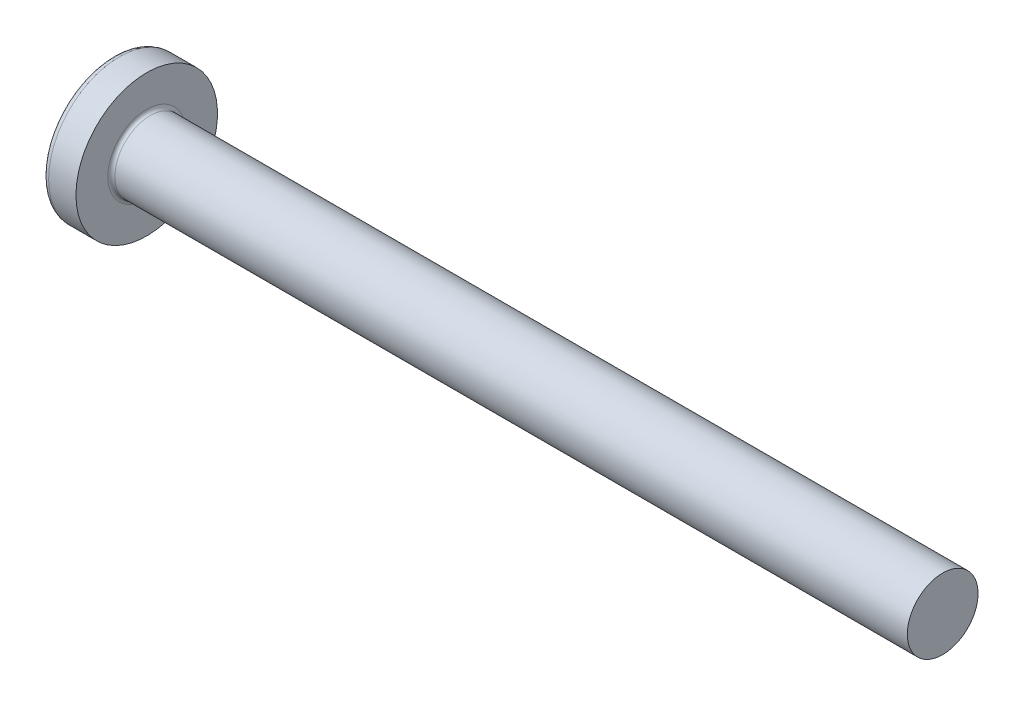
ISO-10303-21;
HEADER;
FILE_DESCRIPTION(('STEP AP214'),'2;1');
FILE_NAME('part.step','',(''),(''),'','','');
FILE_SCHEMA(('AUTOMOTIVE_DESIGN { 1 0 10303 214 1 1 1 1 }'));
ENDSEC;
DATA;
#1=APPLICATION_CONTEXT('core data for automotive mechanical design processes');
#2=APPLICATION_PROTOCOL_DEFINITION('international standard','automotive_design',2000,#1);
#3=PRODUCT_CONTEXT('',#1,'mechanical');
#4=PRODUCT('Part','Part','',(#3));
#5=PRODUCT_RELATED_PRODUCT_CATEGORY('part','',(#4));
#6=PRODUCT_DEFINITION_FORMATION('','',#4);
#7=PRODUCT_DEFINITION_CONTEXT('part definition',#1,'design');
#8=PRODUCT_DEFINITION('design','',#6,#7);
#9=PRODUCT_DEFINITION_SHAPE('','',#8);
#10=(LENGTH_UNIT() NAMED_UNIT(*) SI_UNIT(.MILLI.,.METRE.));
#11=(NAMED_UNIT(*) PLANE_ANGLE_UNIT() SI_UNIT($,.RADIAN.));
#12=(NAMED_UNIT(*) SI_UNIT($,.STERADIAN.) SOLID_ANGLE_UNIT());
#13=UNCERTAINTY_MEASURE_WITH_UNIT(LENGTH_MEASURE(1.E-05),#10,'distance_accuracy_value','');
#14=(GEOMETRIC_REPRESENTATION_CONTEXT(3) GLOBAL_UNCERTAINTY_ASSIGNED_CONTEXT((#13)) GLOBAL_UNIT_ASSIGNED_CONTEXT((#10,
#11,#12)) REPRESENTATION_CONTEXT('',''));
#15=CARTESIAN_POINT('',(0.,0.,0.));
#16=DIRECTION('',(0.,0.,1.));
#17=DIRECTION('',(1.,0.,0.));
#18=AXIS2_PLACEMENT_3D('',#15,#16,#17);
#19=CARTESIAN_POINT('',(6.5,0.,0.));
#20=DIRECTION('',(-1.,0.,0.));
#21=DIRECTION('',(0.,1.,0.));
#22=AXIS2_PLACEMENT_3D('',#19,#20,#21);
#23=SPHERICAL_SURFACE('',#22,6.5);
#24=CARTESIAN_POINT('',(1.26538895452803,0.,0.));
#25=DIRECTION('',(-1.,0.,0.));
#26=DIRECTION('',(0.,0.,1.));
#27=AXIS2_PLACEMENT_3D('',#24,#25,#26);
#28=CIRCLE('',#27,3.85342019543974);
#29=CARTESIAN_POINT('',(1.26538895452803,0.,3.85342019543974));
#30=VERTEX_POINT('',#29);
#31=EDGE_CURVE('E213',#30,#30,#28,.T.);
#32=ORIENTED_EDGE('',*,*,#31,.T.);
#33=EDGE_LOOP('',(#32));
#34=FACE_BOUND('',#33,.T.);
#35=CARTESIAN_POINT('',(0.0788099820016241,0.,0.));
#36=DIRECTION('',(1.,0.,0.));
#37=DIRECTION('',(0.,0.,-1.));
#38=AXIS2_PLACEMENT_3D('',#35,#36,#37);
#39=CIRCLE('',#38,1.0091178091571);
#40=CARTESIAN_POINT('',(0.0788099820016251,-0.514999999999997,-0.867809744562727));
#41=VERTEX_POINT('',#40);
#42=CARTESIAN_POINT('',(0.0788099820016241,-0.867809744562722,-0.515));
#43=VERTEX_POINT('',#42);
#44=EDGE_CURVE('E340',#41,#43,#39,.F.);
#45=ORIENTED_EDGE('',*,*,#44,.F.);
#46=CARTESIAN_POINT('',(6.5,-0.515,0.));
#47=DIRECTION('',(0.,1.,0.));
#48=DIRECTION('',(0.,0.,1.));
#49=AXIS2_PLACEMENT_3D('',#46,#47,#48);
#50=CIRCLE('',#49,6.47956595768575);
#51=CARTESIAN_POINT('',(0.331830520157854,-0.514999999999993,-1.98455543332603));
#52=VERTEX_POINT('',#51);
#53=EDGE_CURVE('E273',#52,#41,#50,.T.);
#54=ORIENTED_EDGE('',*,*,#53,.F.);
#55=CARTESIAN_POINT('',(6.06443225879603,0.,0.873613881878153));
#56=DIRECTION('',(0.446197753347436,0.,-0.894934391398443));
#57=DIRECTION('',(-0.894934391398442,0.,-0.446197753347436));
#58=AXIS2_PLACEMENT_3D('',#55,#56,#57);
#59=CIRCLE('',#58,6.42628038045433);
#60=CARTESIAN_POINT('',(0.331830520157854,0.515000000000007,-1.98455543332603));
#61=VERTEX_POINT('',#60);
#62=EDGE_CURVE('E247',#52,#61,#59,.T.);
#63=ORIENTED_EDGE('',*,*,#62,.T.);
#64=CARTESIAN_POINT('',(6.5,0.515,0.));
#65=DIRECTION('',(0.,-1.,0.));
#66=DIRECTION('',(0.,0.,-1.));
#67=AXIS2_PLACEMENT_3D('',#64,#65,#66);
#68=CIRCLE('',#67,6.47956595768575);
#69=CARTESIAN_POINT('',(0.0788099820016249,0.515000000000003,-0.867809744562724));
#70=VERTEX_POINT('',#69);
#71=EDGE_CURVE('E302',#70,#61,#68,.T.);
#72=ORIENTED_EDGE('',*,*,#71,.F.);
#73=CARTESIAN_POINT('',(0.0788099820016241,0.867809744562721,-0.515));
#74=VERTEX_POINT('',#73);
#75=EDGE_CURVE('E355',#74,#70,#39,.F.);
#76=ORIENTED_EDGE('',*,*,#75,.F.);
#77=CARTESIAN_POINT('',(6.5,0.,-0.515));
#78=DIRECTION('',(0.,0.,1.));
#79=DIRECTION('',(1.,0.,0.));
#80=AXIS2_PLACEMENT_3D('',#77,#78,#79);
#81=CIRCLE('',#80,6.47956595768575);
#82=CARTESIAN_POINT('',(0.331830520157856,1.98455543332603,-0.515));
#83=VERTEX_POINT('',#82);
#84=EDGE_CURVE('E241',#83,#74,#81,.T.);
#85=ORIENTED_EDGE('',*,*,#84,.F.);
#86=CARTESIAN_POINT('',(6.06443225879604,-0.873613881878154,0.));
#87=DIRECTION('',(0.446197753347436,0.894934391398443,0.));
#88=DIRECTION('',(-0.894934391398442,0.446197753347436,0.));
#89=AXIS2_PLACEMENT_3D('',#86,#87,#88);
#90=CIRCLE('',#89,6.42628038045433);
#91=CARTESIAN_POINT('',(0.331830520157856,1.98455543332603,0.515));
#92=VERTEX_POINT('',#91);
#93=EDGE_CURVE('E244',#83,#92,#90,.T.);
#94=ORIENTED_EDGE('',*,*,#93,.T.);
#95=CARTESIAN_POINT('',(6.5,0.,0.515));
#96=DIRECTION('',(0.,0.,-1.));
#97=DIRECTION('',(0.,1.,0.));
#98=AXIS2_PLACEMENT_3D('',#95,#96,#97);
#99=CIRCLE('',#98,6.47956595768575);
#100=CARTESIAN_POINT('',(0.0788099820016241,0.867809744562721,0.515));
#101=VERTEX_POINT('',#100);
#102=EDGE_CURVE('E237',#101,#92,#99,.T.);
#103=ORIENTED_EDGE('',*,*,#102,.F.);
#104=CARTESIAN_POINT('',(0.0788099820016251,0.514999999999997,0.867809744562727));
#105=VERTEX_POINT('',#104);
#106=EDGE_CURVE('E354',#105,#101,#39,.F.);
#107=ORIENTED_EDGE('',*,*,#106,.F.);
#108=CARTESIAN_POINT('',(0.331830520157856,0.514999999999993,1.98455543332603));
#109=VERTEX_POINT('',#108);
#110=EDGE_CURVE('E257',#109,#105,#68,.T.);
#111=ORIENTED_EDGE('',*,*,#110,.F.);
#112=CARTESIAN_POINT('',(6.06443225879603,0.,-0.873613881878153));
#113=DIRECTION('',(0.446197753347436,0.,0.894934391398443));
#114=DIRECTION('',(0.894934391398442,0.,-0.446197753347436));
#115=AXIS2_PLACEMENT_3D('',#112,#113,#114);
#116=CIRCLE('',#115,6.42628038045433);
#117=CARTESIAN_POINT('',(0.331830520157856,-0.515000000000007,1.98455543332603));
#118=VERTEX_POINT('',#117);
#119=EDGE_CURVE('E48',#109,#118,#116,.T.);
#120=ORIENTED_EDGE('',*,*,#119,.T.);
#121=CARTESIAN_POINT('',(0.0788099820016253,-0.515000000000003,0.867809744562724));
#122=VERTEX_POINT('',#121);
#123=EDGE_CURVE('E254',#122,#118,#50,.T.);
#124=ORIENTED_EDGE('',*,*,#123,.F.);
#125=CARTESIAN_POINT('',(0.0788099820016241,-0.867809744562722,0.515));
#126=VERTEX_POINT('',#125);
#127=EDGE_CURVE('E390',#126,#122,#39,.F.);
#128=ORIENTED_EDGE('',*,*,#127,.F.);
#129=CARTESIAN_POINT('',(0.331830520157854,-1.98455543332603,0.515));
#130=VERTEX_POINT('',#129);
#131=EDGE_CURVE('E238',#130,#126,#99,.T.);
#132=ORIENTED_EDGE('',*,*,#131,.F.);
#133=CARTESIAN_POINT('',(6.06443225879603,0.873613881878153,0.));
#134=DIRECTION('',(0.446197753347436,-0.894934391398443,0.));
#135=DIRECTION('',(0.894934391398442,0.446197753347436,0.));
#136=AXIS2_PLACEMENT_3D('',#133,#134,#135);
#137=CIRCLE('',#136,6.42628038045433);
#138=CARTESIAN_POINT('',(0.331830520157854,-1.98455543332603,-0.515));
#139=VERTEX_POINT('',#138);
#140=EDGE_CURVE('E234',#130,#139,#137,.T.);
#141=ORIENTED_EDGE('',*,*,#140,.T.);
#142=EDGE_CURVE('E63',#43,#139,#81,.T.);
#143=ORIENTED_EDGE('',*,*,#142,.F.);
#144=EDGE_LOOP('',(#45,#54,#63,#72,#76,#85,#94,#103,#107,#111,#120,#124,#128,#132,#141,#143));
#145=FACE_BOUND('',#144,.T.);
#146=ADVANCED_FACE('F34',(#34,#145),#23,.T.);
#147=CARTESIAN_POINT('',(0.,2.15,-0.515));
#148=DIRECTION('',(0.,0.,1.));
#149=DIRECTION('',(1.,0.,0.));
#150=AXIS2_PLACEMENT_3D('',#147,#148,#149);
#151=PLANE('',#150);
#152=ORIENTED_EDGE('',*,*,#84,.T.);
#153=CARTESIAN_POINT('',(-1.51195208675156,0.994972220320187,-0.515));
#154=CARTESIAN_POINT('',(-1.20405981949279,0.970722016949957,-0.515));
#155=CARTESIAN_POINT('',(-0.896180907521174,0.94629910991965,-0.515));
#156=CARTESIAN_POINT('',(-0.280449079832185,0.896981122427851,-0.515));
#157=CARTESIAN_POINT('',(0.0274038344396872,0.872086023934882,-0.515));
#158=CARTESIAN_POINT('',(0.489146739515351,0.83429553519528,-0.515));
#159=CARTESIAN_POINT('',(0.643055047553846,0.821624058404092,-0.515));
#160=CARTESIAN_POINT('',(0.950856520197141,0.796108332639504,-0.515));
#161=CARTESIAN_POINT('',(1.10474968487868,0.783264084592465,-0.515));
#162=CARTESIAN_POINT('',(1.41251352095103,0.757376569093378,-0.515));
#163=CARTESIAN_POINT('',(1.56638419296577,0.744333309065218,-0.515));
#164=CARTESIAN_POINT('',(1.87410847343335,0.718013273188896,-0.515));
#165=CARTESIAN_POINT('',(2.02796208151372,0.704736492982792,-0.515));
#166=CARTESIAN_POINT('',(2.36455311890989,0.675386943006726,-0.515));
#167=CARTESIAN_POINT('',(2.54728562293342,0.659257575640986,-0.515));
#168=CARTESIAN_POINT('',(2.91270624109256,0.626517182479888,-0.515));
#169=CARTESIAN_POINT('',(3.09539435554037,0.609906160177238,-0.515));
#170=CARTESIAN_POINT('',(3.46069832191612,0.576073027116422,-0.515));
#171=CARTESIAN_POINT('',(3.64331417870068,0.558850968932728,-0.515));
#172=CARTESIAN_POINT('',(4.00847437496567,0.523604864540038,-0.515));
#173=CARTESIAN_POINT('',(4.19101871216888,0.505580794604253,-0.515));
#174=CARTESIAN_POINT('',(4.55606208157937,0.468429191666488,-0.515));
#175=CARTESIAN_POINT('',(4.73856107358022,0.449301262281854,-0.515));
#176=CARTESIAN_POINT('',(5.10337547353418,0.409473604748925,-0.515));
#177=CARTESIAN_POINT('',(5.28569089526422,0.38877400510607,-0.515));
#178=CARTESIAN_POINT('',(5.55897278495412,0.355828287527265,-0.515));
#179=CARTESIAN_POINT('',(5.65005277419686,0.344527918782739,-0.515));
#180=CARTESIAN_POINT('',(5.83209904103607,0.321075174263032,-0.515));
#181=CARTESIAN_POINT('',(5.92306532397915,0.308922840209687,-0.515));
#182=CARTESIAN_POINT('',(6.10486078872898,0.283427334451931,-0.515));
#183=CARTESIAN_POINT('',(6.19568992299379,0.270083817601715,-0.515));
#184=CARTESIAN_POINT('',(6.33172773785679,0.248701420809952,-0.515));
#185=CARTESIAN_POINT('',(6.37704304473344,0.241345446705305,-0.515));
#186=CARTESIAN_POINT('',(6.4675722520141,0.226018953559339,-0.515));
#187=CARTESIAN_POINT('',(6.51278614568083,0.218048394864477,-0.515));
#188=CARTESIAN_POINT('',(6.55793125759548,0.209691465274946,-0.515));
#189=B_SPLINE_CURVE_WITH_KNOTS('',3,(#153,#154,#155,#156,#157,#158,#159,#160,#161,#162,#163,
#164,#165,#166,#167,#168,#169,#170,#171,#172,#173,#174,#175,#176,#177,#178,#179,#180,#181,#182,
#183,#184,#185,#186,#187,#188),.UNSPECIFIED.,.F.,.F.,(4,2,2,2,2,2,2,2,2,2,2,2,2,2,2,2,2,4),(0.,
0.92653770978172,1.85311087258339,2.31639796016285,2.77968256468771,3.24294992902054,
3.70622594801777,4.25655436065378,4.80687878359543,5.35715597005738,5.90744944680717,
6.45794177197673,7.00838913527399,7.28372117336898,7.55903973750591,7.83443833587748,
7.97216007460854,8.10989070671571),.UNSPECIFIED.);
#190=CARTESIAN_POINT('',(2.34,0.677477674908923,-0.515));
#191=VERTEX_POINT('',#190);
#192=EDGE_CURVE('E377',#74,#191,#189,.T.);
#193=ORIENTED_EDGE('',*,*,#192,.T.);
#194=DIRECTION('',(0.,1.,0.));
#195=VECTOR('',#194,1.);
#196=CARTESIAN_POINT('',(2.34,-0.983319232260742,-0.515));
#197=LINE('',#196,#195);
#198=CARTESIAN_POINT('',(2.34,0.983319232260743,-0.515));
#199=VERTEX_POINT('',#198);
#200=EDGE_CURVE('E323',#191,#199,#197,.T.);
#201=ORIENTED_EDGE('',*,*,#200,.T.);
#202=DIRECTION('',(0.894934391398442,-0.446197753347436,0.));
#203=VECTOR('',#202,1.);
#204=CARTESIAN_POINT('',(0.,2.15,-0.515));
#205=LINE('',#204,#203);
#206=EDGE_CURVE('E214',#83,#199,#205,.T.);
#207=ORIENTED_EDGE('',*,*,#206,.F.);
#208=EDGE_LOOP('',(#152,#193,#201,#207));
#209=FACE_BOUND('',#208,.T.);
#210=ADVANCED_FACE('F169',(#209),#151,.T.);
#211=CARTESIAN_POINT('',(2.34,-0.983319232260742,-0.515));
#212=VERTEX_POINT('',#211);
#213=CARTESIAN_POINT('',(2.34,-0.677477674908923,-0.515));
#214=VERTEX_POINT('',#213);
#215=EDGE_CURVE('E222',#212,#214,#197,.T.);
#216=ORIENTED_EDGE('',*,*,#215,.T.);
#217=CARTESIAN_POINT('',(-1.51195208675156,-0.994972220320187,-0.515));
#218=CARTESIAN_POINT('',(-1.20405981949279,-0.970722016949957,-0.515));
#219=CARTESIAN_POINT('',(-0.896180907521174,-0.94629910991965,-0.515));
#220=CARTESIAN_POINT('',(-0.280449079832185,-0.896981122427851,-0.515));
#221=CARTESIAN_POINT('',(0.0274038344396872,-0.872086023934882,-0.515));
#222=CARTESIAN_POINT('',(0.489146739515351,-0.83429553519528,-0.515));
#223=CARTESIAN_POINT('',(0.643055047553846,-0.821624058404092,-0.515));
#224=CARTESIAN_POINT('',(0.950856520197141,-0.796108332639504,-0.515));
#225=CARTESIAN_POINT('',(1.10474968487868,-0.783264084592465,-0.515));
#226=CARTESIAN_POINT('',(1.41251352095103,-0.757376569093378,-0.515));
#227=CARTESIAN_POINT('',(1.56638419296577,-0.744333309065218,-0.515));
#228=CARTESIAN_POINT('',(1.87410847343335,-0.718013273188896,-0.515));
#229=CARTESIAN_POINT('',(2.02796208151372,-0.704736492982792,-0.515));
#230=CARTESIAN_POINT('',(2.36455311890989,-0.675386943006726,-0.515));
#231=CARTESIAN_POINT('',(2.54728562293342,-0.659257575640986,-0.515));
#232=CARTESIAN_POINT('',(2.91270624109256,-0.626517182479888,-0.515));
#233=CARTESIAN_POINT('',(3.09539435554038,-0.609906160177238,-0.515));
#234=CARTESIAN_POINT('',(3.46069832191613,-0.576073027116421,-0.515));
#235=CARTESIAN_POINT('',(3.64331417870068,-0.558850968932727,-0.515));
#236=CARTESIAN_POINT('',(4.00847437496567,-0.523604864540037,-0.515));
#237=CARTESIAN_POINT('',(4.19101871216888,-0.505580794604253,-0.515));
#238=CARTESIAN_POINT('',(4.55606208157937,-0.468429191666488,-0.515));
#239=CARTESIAN_POINT('',(4.73856107358023,-0.449301262281854,-0.515));
#240=CARTESIAN_POINT('',(5.10337547353419,-0.409473604748925,-0.515));
#241=CARTESIAN_POINT('',(5.28569089526422,-0.38877400510607,-0.515));
#242=CARTESIAN_POINT('',(5.55897278495412,-0.355828287527264,-0.515));
#243=CARTESIAN_POINT('',(5.65005277419686,-0.344527918782738,-0.515));
#244=CARTESIAN_POINT('',(5.83209904103608,-0.321075174263031,-0.515));
#245=CARTESIAN_POINT('',(5.92306532397915,-0.308922840209686,-0.515));
#246=CARTESIAN_POINT('',(6.10486078872898,-0.283427334451931,-0.515));
#247=CARTESIAN_POINT('',(6.1956899229938,-0.270083817601715,-0.515));
#248=CARTESIAN_POINT('',(6.33172773785679,-0.248701420809952,-0.515));
#249=CARTESIAN_POINT('',(6.37704304473344,-0.241345446705305,-0.515));
#250=CARTESIAN_POINT('',(6.4675722520141,-0.226018953559339,-0.515));
#251=CARTESIAN_POINT('',(6.51278614568083,-0.218048394864477,-0.515));
#252=CARTESIAN_POINT('',(6.55793125759549,-0.209691465274945,-0.515));
#253=B_SPLINE_CURVE_WITH_KNOTS('',3,(#217,#218,#219,#220,#221,#222,#223,#224,#225,#226,#227,
#228,#229,#230,#231,#232,#233,#234,#235,#236,#237,#238,#239,#240,#241,#242,#243,#244,#245,#246,
#247,#248,#249,#250,#251,#252),.UNSPECIFIED.,.F.,.F.,(4,2,2,2,2,2,2,2,2,2,2,2,2,2,2,2,2,4),(0.,
0.92653770978172,1.85311087258339,2.31639796016285,2.77968256468771,3.24294992902054,
3.70622594801777,4.25655436065378,4.80687878359543,5.35715597005738,5.90744944680718,
6.45794177197673,7.008389135274,7.28372117336899,7.55903973750591,7.83443833587748,
7.97216007460854,8.10989070671571),.UNSPECIFIED.);
#254=EDGE_CURVE('E353',#214,#43,#253,.F.);
#255=ORIENTED_EDGE('',*,*,#254,.T.);
#256=ORIENTED_EDGE('',*,*,#142,.T.);
#257=DIRECTION('',(0.894934391398442,0.446197753347436,0.));
#258=VECTOR('',#257,1.);
#259=CARTESIAN_POINT('',(0.,-2.15,-0.515));
#260=LINE('',#259,#258);
#261=EDGE_CURVE('E305',#139,#212,#260,.T.);
#262=ORIENTED_EDGE('',*,*,#261,.T.);
#263=EDGE_LOOP('',(#216,#255,#256,#262));
#264=FACE_BOUND('',#263,.T.);
#265=ADVANCED_FACE('F175',(#264),#151,.T.);
#266=CARTESIAN_POINT('',(0.,-2.15,0.515));
#267=DIRECTION('',(0.,0.,-1.));
#268=DIRECTION('',(0.,1.,0.));
#269=AXIS2_PLACEMENT_3D('',#266,#267,#268);
#270=PLANE('',#269);
#271=DIRECTION('',(0.,-1.,0.));
#272=VECTOR('',#271,1.);
#273=CARTESIAN_POINT('',(2.34,0.983319232260742,0.515));
#274=LINE('',#273,#272);
#275=CARTESIAN_POINT('',(2.34,0.983319232260743,0.515));
#276=VERTEX_POINT('',#275);
#277=CARTESIAN_POINT('',(2.34,0.677477674908923,0.515));
#278=VERTEX_POINT('',#277);
#279=EDGE_CURVE('E313',#276,#278,#274,.T.);
#280=ORIENTED_EDGE('',*,*,#279,.T.);
#281=CARTESIAN_POINT('',(-1.51195208754037,0.994972220382297,0.515));
#282=CARTESIAN_POINT('',(-1.20405982018868,0.970722017005064,0.515));
#283=CARTESIAN_POINT('',(-0.896180908124144,0.946299109967688,0.515));
#284=CARTESIAN_POINT('',(-0.280449080249312,0.896981122461527,0.515));
#285=CARTESIAN_POINT('',(0.0274038341154851,0.872086023961265,0.515));
#286=CARTESIAN_POINT('',(0.489146739371409,0.834295535207136,0.515));
#287=CARTESIAN_POINT('',(0.643055047497245,0.821624058408796,0.515));
#288=CARTESIAN_POINT('',(0.950856520315204,0.796108332629705,0.515));
#289=CARTESIAN_POINT('',(1.10474968508407,0.783264084575317,0.515));
#290=CARTESIAN_POINT('',(1.41251352133103,0.757376569061287,0.515));
#291=CARTESIAN_POINT('',(1.56638419343305,0.744333309025534,0.515));
#292=CARTESIAN_POINT('',(1.87410847407519,0.718013273133716,0.515));
#293=CARTESIAN_POINT('',(2.02796208224283,0.70473649291971,0.515));
#294=CARTESIAN_POINT('',(2.36455311972626,0.675386942934956,0.515));
#295=CARTESIAN_POINT('',(2.5472856237498,0.659257575568568,0.515));
#296=CARTESIAN_POINT('',(2.91270624190895,0.626517182406014,0.515));
#297=CARTESIAN_POINT('',(3.09539435635676,0.609906160102555,0.515));
#298=CARTESIAN_POINT('',(3.46069832273244,0.57607302703989,0.515));
#299=CARTESIAN_POINT('',(3.64331417951694,0.558850968855157,0.515));
#300=CARTESIAN_POINT('',(4.00847437578178,0.523604864460044,0.515));
#301=CARTESIAN_POINT('',(4.1910187129849,0.505580794522876,0.515));
#302=CARTESIAN_POINT('',(4.55606208239526,0.46842919158178,0.515));
#303=CARTESIAN_POINT('',(4.73856107439606,0.449301262195198,0.515));
#304=CARTESIAN_POINT('',(5.10337547434977,0.409473604657436,0.515));
#305=CARTESIAN_POINT('',(5.2856908960796,0.388774005011695,0.515));
#306=CARTESIAN_POINT('',(5.55897278576906,0.355828287427083,0.515));
#307=CARTESIAN_POINT('',(5.65005277501166,0.344527918680369,0.515));
#308=CARTESIAN_POINT('',(5.83209904185046,0.321075174155501,0.515));
#309=CARTESIAN_POINT('',(5.92306532479326,0.308922840099182,0.515));
#310=CARTESIAN_POINT('',(6.10486078954238,0.283427334334154,0.515));
#311=CARTESIAN_POINT('',(6.19568992380676,0.270083817479638,0.515));
#312=CARTESIAN_POINT('',(6.33172773866873,0.24870142067948,0.515));
#313=CARTESIAN_POINT('',(6.37704304554499,0.241345446571708,0.515));
#314=CARTESIAN_POINT('',(6.46757225282465,0.226018953418425,0.515));
#315=CARTESIAN_POINT('',(6.51278614649077,0.21804839471937,0.515));
#316=CARTESIAN_POINT('',(6.55793125840465,0.209691465124903,0.515));
#317=B_SPLINE_CURVE_WITH_KNOTS('',3,(#281,#282,#283,#284,#285,#286,#287,#288,#289,#290,#291,
#292,#293,#294,#295,#296,#297,#298,#299,#300,#301,#302,#303,#304,#305,#306,#307,#308,#309,#310,
#311,#312,#313,#314,#315,#316),.UNSPECIFIED.,.F.,.F.,(4,2,2,2,2,2,2,2,2,2,2,2,2,2,2,2,2,4),(0.,
0.926537710061277,1.85311087314258,2.31639796098494,2.77968256577269,3.24294993036838,
3.70622594962848,4.25655436226469,4.80687878520654,5.3571559716686,5.90744944841854,
6.45794177358856,7.00838913688618,7.28372117498156,7.55903973911884,7.83443833749096,
7.97216007622235,8.10989070832989),.UNSPECIFIED.);
#318=EDGE_CURVE('E278',#278,#101,#317,.F.);
#319=ORIENTED_EDGE('',*,*,#318,.T.);
#320=ORIENTED_EDGE('',*,*,#102,.T.);
#321=DIRECTION('',(0.894934391398442,-0.446197753347436,0.));
#322=VECTOR('',#321,1.);
#323=CARTESIAN_POINT('',(0.,2.15,0.515));
#324=LINE('',#323,#322);
#325=EDGE_CURVE('E219',#92,#276,#324,.T.);
#326=ORIENTED_EDGE('',*,*,#325,.T.);
#327=EDGE_LOOP('',(#280,#319,#320,#326));
#328=FACE_BOUND('',#327,.T.);
#329=ADVANCED_FACE('F373',(#328),#270,.T.);
#330=ORIENTED_EDGE('',*,*,#131,.T.);
#331=CARTESIAN_POINT('',(-1.51195208754037,-0.994972220382297,0.515));
#332=CARTESIAN_POINT('',(-1.20405982018868,-0.970722017005064,0.515));
#333=CARTESIAN_POINT('',(-0.896180908124144,-0.946299109967688,0.515));
#334=CARTESIAN_POINT('',(-0.280449080249312,-0.896981122461527,0.515));
#335=CARTESIAN_POINT('',(0.0274038341154852,-0.872086023961264,0.515));
#336=CARTESIAN_POINT('',(0.489146739371408,-0.834295535207136,0.515));
#337=CARTESIAN_POINT('',(0.643055047497245,-0.821624058408796,0.515));
#338=CARTESIAN_POINT('',(0.950856520315204,-0.796108332629705,0.515));
#339=CARTESIAN_POINT('',(1.10474968508407,-0.783264084575317,0.515));
#340=CARTESIAN_POINT('',(1.41251352133103,-0.757376569061287,0.515));
#341=CARTESIAN_POINT('',(1.56638419343305,-0.744333309025534,0.515));
#342=CARTESIAN_POINT('',(1.87410847407519,-0.718013273133716,0.515));
#343=CARTESIAN_POINT('',(2.02796208224283,-0.70473649291971,0.515));
#344=CARTESIAN_POINT('',(2.36455311972626,-0.675386942934956,0.515));
#345=CARTESIAN_POINT('',(2.5472856237498,-0.659257575568568,0.515));
#346=CARTESIAN_POINT('',(2.91270624190895,-0.626517182406014,0.515));
#347=CARTESIAN_POINT('',(3.09539435635676,-0.609906160102555,0.515));
#348=CARTESIAN_POINT('',(3.46069832273244,-0.57607302703989,0.515));
#349=CARTESIAN_POINT('',(3.64331417951694,-0.558850968855157,0.515));
#350=CARTESIAN_POINT('',(4.00847437578178,-0.523604864460045,0.515));
#351=CARTESIAN_POINT('',(4.1910187129849,-0.505580794522877,0.515));
#352=CARTESIAN_POINT('',(4.55606208239525,-0.46842919158178,0.515));
#353=CARTESIAN_POINT('',(4.73856107439606,-0.449301262195199,0.515));
#354=CARTESIAN_POINT('',(5.10337547434977,-0.409473604657436,0.515));
#355=CARTESIAN_POINT('',(5.2856908960796,-0.388774005011696,0.515));
#356=CARTESIAN_POINT('',(5.55897278576906,-0.355828287427083,0.515));
#357=CARTESIAN_POINT('',(5.65005277501166,-0.34452791868037,0.515));
#358=CARTESIAN_POINT('',(5.83209904185046,-0.321075174155501,0.515));
#359=CARTESIAN_POINT('',(5.92306532479326,-0.308922840099182,0.515));
#360=CARTESIAN_POINT('',(6.10486078954238,-0.283427334334154,0.515));
#361=CARTESIAN_POINT('',(6.19568992380675,-0.270083817479639,0.515));
#362=CARTESIAN_POINT('',(6.33172773866873,-0.24870142067948,0.515));
#363=CARTESIAN_POINT('',(6.37704304554499,-0.241345446571709,0.515));
#364=CARTESIAN_POINT('',(6.46757225282465,-0.226018953418425,0.515));
#365=CARTESIAN_POINT('',(6.51278614649077,-0.21804839471937,0.515));
#366=CARTESIAN_POINT('',(6.55793125840465,-0.209691465124903,0.515));
#367=B_SPLINE_CURVE_WITH_KNOTS('',3,(#331,#332,#333,#334,#335,#336,#337,#338,#339,#340,#341,
#342,#343,#344,#345,#346,#347,#348,#349,#350,#351,#352,#353,#354,#355,#356,#357,#358,#359,#360,
#361,#362,#363,#364,#365,#366),.UNSPECIFIED.,.F.,.F.,(4,2,2,2,2,2,2,2,2,2,2,2,2,2,2,2,2,4),(0.,
0.926537710061277,1.85311087314258,2.31639796098494,2.77968256577269,3.24294993036838,
3.70622594962848,4.25655436226469,4.80687878520654,5.3571559716686,5.90744944841854,
6.45794177358856,7.00838913688618,7.28372117498156,7.55903973911884,7.83443833749095,
7.97216007622235,8.10989070832989),.UNSPECIFIED.);
#368=CARTESIAN_POINT('',(2.34,-0.677477674908923,0.515));
#369=VERTEX_POINT('',#368);
#370=EDGE_CURVE('E391',#126,#369,#367,.T.);
#371=ORIENTED_EDGE('',*,*,#370,.T.);
#372=CARTESIAN_POINT('',(2.34,-0.983319232260742,0.515));
#373=VERTEX_POINT('',#372);
#374=EDGE_CURVE('E315',#369,#373,#274,.T.);
#375=ORIENTED_EDGE('',*,*,#374,.T.);
#376=DIRECTION('',(0.894934391398442,0.446197753347436,0.));
#377=VECTOR('',#376,1.);
#378=CARTESIAN_POINT('',(0.,-2.15,0.515));
#379=LINE('',#378,#377);
#380=EDGE_CURVE('E307',#130,#373,#379,.T.);
#381=ORIENTED_EDGE('',*,*,#380,.F.);
#382=EDGE_LOOP('',(#330,#371,#375,#381));
#383=FACE_BOUND('',#382,.T.);
#384=ADVANCED_FACE('F421',(#383),#270,.T.);
#385=CARTESIAN_POINT('',(2.34,0.983319232260742,-0.515));
#386=DIRECTION('',(-1.,0.,0.));
#387=DIRECTION('',(0.,0.,1.));
#388=AXIS2_PLACEMENT_3D('',#385,#386,#387);
#389=PLANE('',#388);
#390=ORIENTED_EDGE('',*,*,#374,.F.);
#391=CARTESIAN_POINT('',(2.34,0.,0.));
#392=DIRECTION('',(-1.,0.,0.));
#393=DIRECTION('',(0.,0.,1.));
#394=AXIS2_PLACEMENT_3D('',#391,#392,#393);
#395=CIRCLE('',#394,0.851);
#396=EDGE_CURVE('E348',#214,#369,#395,.T.);
#397=ORIENTED_EDGE('',*,*,#396,.F.);
#398=ORIENTED_EDGE('',*,*,#215,.F.);
#399=DIRECTION('',(0.,0.,1.));
#400=VECTOR('',#399,1.);
#401=CARTESIAN_POINT('',(2.34,-0.983319232260742,-0.515));
#402=LINE('',#401,#400);
#403=EDGE_CURVE('E310',#212,#373,#402,.T.);
#404=ORIENTED_EDGE('',*,*,#403,.T.);
#405=EDGE_LOOP('',(#390,#397,#398,#404));
#406=FACE_BOUND('',#405,.T.);
#407=ADVANCED_FACE('F414',(#406),#389,.T.);
#408=DIRECTION('',(0.,0.,-1.));
#409=VECTOR('',#408,1.);
#410=CARTESIAN_POINT('',(2.34,-0.515000000000004,0.983319232260741));
#411=LINE('',#410,#409);
#412=CARTESIAN_POINT('',(2.34,-0.514999999999998,-0.677477674908925));
#413=VERTEX_POINT('',#412);
#414=CARTESIAN_POINT('',(2.34,-0.514999999999996,-0.983319232260744));
#415=VERTEX_POINT('',#414);
#416=EDGE_CURVE('E296',#413,#415,#411,.T.);
#417=ORIENTED_EDGE('',*,*,#416,.F.);
#418=CARTESIAN_POINT('',(2.34,0.515000000000002,-0.677477674908921));
#419=VERTEX_POINT('',#418);
#420=EDGE_CURVE('E55',#419,#413,#395,.T.);
#421=ORIENTED_EDGE('',*,*,#420,.F.);
#422=DIRECTION('',(0.,0.,1.));
#423=VECTOR('',#422,1.);
#424=CARTESIAN_POINT('',(2.34,0.515000000000004,-0.983319232260741));
#425=LINE('',#424,#423);
#426=CARTESIAN_POINT('',(2.34,0.515000000000004,-0.983319232260741));
#427=VERTEX_POINT('',#426);
#428=EDGE_CURVE('E299',#427,#419,#425,.T.);
#429=ORIENTED_EDGE('',*,*,#428,.F.);
#430=DIRECTION('',(0.,-1.,0.));
#431=VECTOR('',#430,1.);
#432=CARTESIAN_POINT('',(2.34,0.515000000000004,-0.983319232260741));
#433=LINE('',#432,#431);
#434=EDGE_CURVE('E290',#427,#415,#433,.T.);
#435=ORIENTED_EDGE('',*,*,#434,.T.);
#436=EDGE_LOOP('',(#417,#421,#429,#435));
#437=FACE_BOUND('',#436,.T.);
#438=ADVANCED_FACE('F343',(#437),#389,.T.);
#439=ORIENTED_EDGE('',*,*,#200,.F.);
#440=EDGE_CURVE('E347',#278,#191,#395,.T.);
#441=ORIENTED_EDGE('',*,*,#440,.F.);
#442=ORIENTED_EDGE('',*,*,#279,.F.);
#443=DIRECTION('',(0.,0.,-1.));
#444=VECTOR('',#443,1.);
#445=CARTESIAN_POINT('',(2.34,0.983319232260742,0.515));
#446=LINE('',#445,#444);
#447=EDGE_CURVE('E316',#276,#199,#446,.T.);
#448=ORIENTED_EDGE('',*,*,#447,.T.);
#449=EDGE_LOOP('',(#439,#441,#442,#448));
#450=FACE_BOUND('',#449,.T.);
#451=ADVANCED_FACE('F415',(#450),#389,.T.);
#452=CARTESIAN_POINT('',(0.,0.514999999999993,2.15));
#453=DIRECTION('',(0.,-1.,0.));
#454=DIRECTION('',(1.,0.,0.));
#455=AXIS2_PLACEMENT_3D('',#452,#453,#454);
#456=PLANE('',#455);
#457=ORIENTED_EDGE('',*,*,#110,.T.);
#458=CARTESIAN_POINT('',(-1.51195208754037,0.514999999999997,0.994972220382299));
#459=CARTESIAN_POINT('',(-1.20405982018868,0.514999999999997,0.970722017005065));
#460=CARTESIAN_POINT('',(-0.896180908124144,0.514999999999997,0.94629910996769));
#461=CARTESIAN_POINT('',(-0.280449080249312,0.514999999999997,0.896981122461529));
#462=CARTESIAN_POINT('',(0.0274038341154852,0.514999999999997,0.872086023961266));
#463=CARTESIAN_POINT('',(0.489146739371409,0.514999999999997,0.834295535207138));
#464=CARTESIAN_POINT('',(0.643055047497245,0.514999999999997,0.821624058408797));
#465=CARTESIAN_POINT('',(0.950856520315204,0.514999999999997,0.796108332629707));
#466=CARTESIAN_POINT('',(1.10474968508407,0.514999999999997,0.783264084575319));
#467=CARTESIAN_POINT('',(1.41251352133103,0.514999999999997,0.757376569061289));
#468=CARTESIAN_POINT('',(1.56638419343305,0.514999999999997,0.744333309025535));
#469=CARTESIAN_POINT('',(1.87410847407519,0.514999999999998,0.718013273133717));
#470=CARTESIAN_POINT('',(2.02796208224283,0.514999999999998,0.704736492919711));
#471=CARTESIAN_POINT('',(2.36455311972626,0.514999999999998,0.675386942934957));
#472=CARTESIAN_POINT('',(2.5472856237498,0.514999999999998,0.65925757556857));
#473=CARTESIAN_POINT('',(2.91270624190895,0.514999999999998,0.626517182406016));
#474=CARTESIAN_POINT('',(3.09539435635676,0.514999999999998,0.609906160102557));
#475=CARTESIAN_POINT('',(3.46069832273244,0.514999999999998,0.576073027039891));
#476=CARTESIAN_POINT('',(3.64331417951694,0.514999999999998,0.558850968855159));
#477=CARTESIAN_POINT('',(4.00847437578178,0.514999999999998,0.523604864460046));
#478=CARTESIAN_POINT('',(4.1910187129849,0.514999999999998,0.505580794522878));
#479=CARTESIAN_POINT('',(4.55606208239526,0.514999999999998,0.468429191581782));
#480=CARTESIAN_POINT('',(4.73856107439606,0.514999999999999,0.4493012621952));
#481=CARTESIAN_POINT('',(5.10337547434977,0.514999999999999,0.409473604657437));
#482=CARTESIAN_POINT('',(5.2856908960796,0.514999999999999,0.388774005011697));
#483=CARTESIAN_POINT('',(5.55897278576906,0.514999999999999,0.355828287427085));
#484=CARTESIAN_POINT('',(5.65005277501166,0.514999999999999,0.344527918680371));
#485=CARTESIAN_POINT('',(5.83209904185046,0.514999999999999,0.321075174155502));
#486=CARTESIAN_POINT('',(5.92306532479326,0.514999999999999,0.308922840099184));
#487=CARTESIAN_POINT('',(6.10486078954238,0.514999999999999,0.283427334334156));
#488=CARTESIAN_POINT('',(6.19568992380675,0.514999999999999,0.27008381747964));
#489=CARTESIAN_POINT('',(6.33172773866873,0.514999999999999,0.248701420679482));
#490=CARTESIAN_POINT('',(6.37704304554499,0.514999999999999,0.241345446571711));
#491=CARTESIAN_POINT('',(6.46757225282465,0.514999999999999,0.226018953418427));
#492=CARTESIAN_POINT('',(6.51278614649077,0.514999999999999,0.218048394719372));
#493=CARTESIAN_POINT('',(6.55793125840465,0.514999999999999,0.209691465124905));
#494=B_SPLINE_CURVE_WITH_KNOTS('',3,(#458,#459,#460,#461,#462,#463,#464,#465,#466,#467,#468,
#469,#470,#471,#472,#473,#474,#475,#476,#477,#478,#479,#480,#481,#482,#483,#484,#485,#486,#487,
#488,#489,#490,#491,#492,#493),.UNSPECIFIED.,.F.,.F.,(4,2,2,2,2,2,2,2,2,2,2,2,2,2,2,2,2,4),(0.,
0.926537710061277,1.85311087314258,2.31639796098494,2.77968256577269,3.24294993036838,
3.70622594962848,4.25655436226469,4.80687878520654,5.3571559716686,5.90744944841854,
6.45794177358856,7.00838913688618,7.28372117498156,7.55903973911883,7.83443833749095,
7.97216007622235,8.10989070832989),.UNSPECIFIED.);
#495=CARTESIAN_POINT('',(2.34,0.514999999999998,0.677477674908924));
#496=VERTEX_POINT('',#495);
#497=EDGE_CURVE('E439',#105,#496,#494,.T.);
#498=ORIENTED_EDGE('',*,*,#497,.T.);
#499=CARTESIAN_POINT('',(2.34,0.514999999999997,0.983319232260744));
#500=VERTEX_POINT('',#499);
#501=EDGE_CURVE('E271',#496,#500,#425,.T.);
#502=ORIENTED_EDGE('',*,*,#501,.T.);
#503=DIRECTION('',(0.894934391398442,0.,-0.446197753347436));
#504=VECTOR('',#503,1.);
#505=CARTESIAN_POINT('',(0.,0.514999999999993,2.15));
#506=LINE('',#505,#504);
#507=EDGE_CURVE('E264',#109,#500,#506,.T.);
#508=ORIENTED_EDGE('',*,*,#507,.F.);
#509=EDGE_LOOP('',(#457,#498,#502,#508));
#510=FACE_BOUND('',#509,.T.);
#511=ADVANCED_FACE('F268',(#510),#456,.T.);
#512=CARTESIAN_POINT('',(0.,-0.514999999999992,-2.15));
#513=DIRECTION('',(0.,1.,0.));
#514=DIRECTION('',(0.,0.,1.));
#515=AXIS2_PLACEMENT_3D('',#512,#513,#514);
#516=PLANE('',#515);
#517=CARTESIAN_POINT('',(2.34,-0.515000000000004,0.983319232260741));
#518=VERTEX_POINT('',#517);
#519=CARTESIAN_POINT('',(2.34,-0.515000000000003,0.677477674908921));
#520=VERTEX_POINT('',#519);
#521=EDGE_CURVE('E293',#518,#520,#411,.T.);
#522=ORIENTED_EDGE('',*,*,#521,.T.);
#523=CARTESIAN_POINT('',(-1.51195208675156,-0.515000000000004,0.994972220320185));
#524=CARTESIAN_POINT('',(-1.20405981949279,-0.515000000000003,0.970722016949956));
#525=CARTESIAN_POINT('',(-0.896180907521174,-0.515000000000003,0.946299109919649));
#526=CARTESIAN_POINT('',(-0.280449079832186,-0.515000000000003,0.896981122427849));
#527=CARTESIAN_POINT('',(0.0274038344396871,-0.515000000000003,0.872086023934881));
#528=CARTESIAN_POINT('',(0.489146739515351,-0.515000000000003,0.834295535195278));
#529=CARTESIAN_POINT('',(0.643055047553846,-0.515000000000003,0.82162405840409));
#530=CARTESIAN_POINT('',(0.950856520197141,-0.515000000000003,0.796108332639502));
#531=CARTESIAN_POINT('',(1.10474968487868,-0.515000000000003,0.783264084592463));
#532=CARTESIAN_POINT('',(1.41251352095103,-0.515000000000003,0.757376569093376));
#533=CARTESIAN_POINT('',(1.56638419296577,-0.515000000000003,0.744333309065216));
#534=CARTESIAN_POINT('',(1.87410847343335,-0.515000000000003,0.718013273188894));
#535=CARTESIAN_POINT('',(2.02796208151372,-0.515000000000002,0.70473649298279));
#536=CARTESIAN_POINT('',(2.36455311890989,-0.515000000000002,0.675386943006724));
#537=CARTESIAN_POINT('',(2.54728562293342,-0.515000000000002,0.659257575640984));
#538=CARTESIAN_POINT('',(2.91270624109256,-0.515000000000002,0.626517182479886));
#539=CARTESIAN_POINT('',(3.09539435554037,-0.515000000000002,0.609906160177237));
#540=CARTESIAN_POINT('',(3.46069832191612,-0.515000000000002,0.57607302711642));
#541=CARTESIAN_POINT('',(3.64331417870068,-0.515000000000002,0.558850968932726));
#542=CARTESIAN_POINT('',(4.00847437496567,-0.515000000000002,0.523604864540036));
#543=CARTESIAN_POINT('',(4.19101871216888,-0.515000000000002,0.505580794604251));
#544=CARTESIAN_POINT('',(4.55606208157937,-0.515000000000002,0.468429191666487));
#545=CARTESIAN_POINT('',(4.73856107358022,-0.515000000000002,0.449301262281852));
#546=CARTESIAN_POINT('',(5.10337547353418,-0.515000000000001,0.409473604748923));
#547=CARTESIAN_POINT('',(5.28569089526422,-0.515000000000001,0.388774005106068));
#548=CARTESIAN_POINT('',(5.55897278495412,-0.515000000000001,0.355828287527263));
#549=CARTESIAN_POINT('',(5.65005277419686,-0.515000000000001,0.344527918782737));
#550=CARTESIAN_POINT('',(5.83209904103607,-0.515000000000001,0.32107517426303));
#551=CARTESIAN_POINT('',(5.92306532397915,-0.515000000000001,0.308922840209685));
#552=CARTESIAN_POINT('',(6.10486078872898,-0.515000000000001,0.283427334451929));
#553=CARTESIAN_POINT('',(6.19568992299379,-0.515000000000001,0.270083817601713));
#554=CARTESIAN_POINT('',(6.33172773785679,-0.515000000000001,0.24870142080995));
#555=CARTESIAN_POINT('',(6.37704304473344,-0.515000000000001,0.241345446705303));
#556=CARTESIAN_POINT('',(6.4675722520141,-0.515000000000001,0.226018953559337));
#557=CARTESIAN_POINT('',(6.51278614568083,-0.515000000000001,0.218048394864476));
#558=CARTESIAN_POINT('',(6.55793125759548,-0.515000000000001,0.209691465274944));
#559=B_SPLINE_CURVE_WITH_KNOTS('',3,(#523,#524,#525,#526,#527,#528,#529,#530,#531,#532,#533,
#534,#535,#536,#537,#538,#539,#540,#541,#542,#543,#544,#545,#546,#547,#548,#549,#550,#551,#552,
#553,#554,#555,#556,#557,#558),.UNSPECIFIED.,.F.,.F.,(4,2,2,2,2,2,2,2,2,2,2,2,2,2,2,2,2,4),(0.,
0.92653770978172,1.85311087258339,2.31639796016285,2.77968256468771,3.24294992902054,
3.70622594801777,4.25655436065378,4.80687878359543,5.35715597005738,5.90744944680717,
6.45794177197673,7.008389135274,7.28372117336898,7.55903973750591,7.83443833587748,
7.97216007460854,8.10989070671571),.UNSPECIFIED.);
#560=EDGE_CURVE('E383',#520,#122,#559,.F.);
#561=ORIENTED_EDGE('',*,*,#560,.T.);
#562=ORIENTED_EDGE('',*,*,#123,.T.);
#563=DIRECTION('',(0.894934391398442,0.,-0.446197753347436));
#564=VECTOR('',#563,1.);
#565=CARTESIAN_POINT('',(0.,-0.515000000000008,2.15));
#566=LINE('',#565,#564);
#567=EDGE_CURVE('E266',#118,#518,#566,.T.);
#568=ORIENTED_EDGE('',*,*,#567,.T.);
#569=EDGE_LOOP('',(#522,#561,#562,#568));
#570=FACE_BOUND('',#569,.T.);
#571=ADVANCED_FACE('F204',(#570),#516,.T.);
#572=ORIENTED_EDGE('',*,*,#428,.T.);
#573=CARTESIAN_POINT('',(-1.51195208754037,0.515000000000004,-0.994972220382295));
#574=CARTESIAN_POINT('',(-1.20405982018868,0.515000000000003,-0.970722017005062));
#575=CARTESIAN_POINT('',(-0.896180908124144,0.515000000000003,-0.946299109967686));
#576=CARTESIAN_POINT('',(-0.280449080249312,0.515000000000003,-0.896981122461525));
#577=CARTESIAN_POINT('',(0.0274038341154851,0.515000000000003,-0.872086023961263));
#578=CARTESIAN_POINT('',(0.489146739371408,0.515000000000003,-0.834295535207134));
#579=CARTESIAN_POINT('',(0.643055047497245,0.515000000000003,-0.821624058408794));
#580=CARTESIAN_POINT('',(0.950856520315204,0.515000000000003,-0.796108332629703));
#581=CARTESIAN_POINT('',(1.10474968508407,0.515000000000003,-0.783264084575315));
#582=CARTESIAN_POINT('',(1.41251352133103,0.515000000000003,-0.757376569061285));
#583=CARTESIAN_POINT('',(1.56638419343305,0.515000000000003,-0.744333309025532));
#584=CARTESIAN_POINT('',(1.87410847407519,0.515000000000003,-0.718013273133714));
#585=CARTESIAN_POINT('',(2.02796208224283,0.515000000000002,-0.704736492919708));
#586=CARTESIAN_POINT('',(2.36455311972626,0.515000000000002,-0.675386942934954));
#587=CARTESIAN_POINT('',(2.5472856237498,0.515000000000002,-0.659257575568566));
#588=CARTESIAN_POINT('',(2.91270624190895,0.515000000000002,-0.626517182406012));
#589=CARTESIAN_POINT('',(3.09539435635676,0.515000000000002,-0.609906160102553));
#590=CARTESIAN_POINT('',(3.46069832273244,0.515000000000002,-0.576073027039888));
#591=CARTESIAN_POINT('',(3.64331417951694,0.515000000000002,-0.558850968855155));
#592=CARTESIAN_POINT('',(4.00847437578178,0.515000000000002,-0.523604864460043));
#593=CARTESIAN_POINT('',(4.1910187129849,0.515000000000002,-0.505580794522875));
#594=CARTESIAN_POINT('',(4.55606208239525,0.515000000000002,-0.468429191581779));
#595=CARTESIAN_POINT('',(4.73856107439606,0.515000000000002,-0.449301262195197));
#596=CARTESIAN_POINT('',(5.10337547434977,0.515000000000001,-0.409473604657434));
#597=CARTESIAN_POINT('',(5.2856908960796,0.515000000000001,-0.388774005011694));
#598=CARTESIAN_POINT('',(5.55897278576906,0.515000000000001,-0.355828287427081));
#599=CARTESIAN_POINT('',(5.65005277501166,0.515000000000001,-0.344527918680368));
#600=CARTESIAN_POINT('',(5.83209904185046,0.515000000000001,-0.321075174155499));
#601=CARTESIAN_POINT('',(5.92306532479326,0.515000000000001,-0.30892284009918));
#602=CARTESIAN_POINT('',(6.10486078954238,0.515000000000001,-0.283427334334152));
#603=CARTESIAN_POINT('',(6.19568992380675,0.515000000000001,-0.270083817479637));
#604=CARTESIAN_POINT('',(6.33172773866873,0.515000000000001,-0.248701420679479));
#605=CARTESIAN_POINT('',(6.37704304554499,0.515000000000001,-0.241345446571707));
#606=CARTESIAN_POINT('',(6.46757225282465,0.515000000000001,-0.226018953418423));
#607=CARTESIAN_POINT('',(6.51278614649077,0.515000000000001,-0.218048394719368));
#608=CARTESIAN_POINT('',(6.55793125840465,0.515000000000001,-0.209691465124901));
#609=B_SPLINE_CURVE_WITH_KNOTS('',3,(#573,#574,#575,#576,#577,#578,#579,#580,#581,#582,#583,
#584,#585,#586,#587,#588,#589,#590,#591,#592,#593,#594,#595,#596,#597,#598,#599,#600,#601,#602,
#603,#604,#605,#606,#607,#608),.UNSPECIFIED.,.F.,.F.,(4,2,2,2,2,2,2,2,2,2,2,2,2,2,2,2,2,4),(0.,
0.926537710061278,1.85311087314258,2.31639796098494,2.77968256577269,3.24294993036838,
3.70622594962848,4.25655436226469,4.80687878520654,5.3571559716686,5.90744944841854,
6.45794177358856,7.00838913688618,7.28372117498156,7.55903973911883,7.83443833749095,
7.97216007622235,8.10989070832989),.UNSPECIFIED.);
#610=EDGE_CURVE('E332',#419,#70,#609,.F.);
#611=ORIENTED_EDGE('',*,*,#610,.T.);
#612=ORIENTED_EDGE('',*,*,#71,.T.);
#613=DIRECTION('',(0.894934391398442,0.,0.446197753347436));
#614=VECTOR('',#613,1.);
#615=CARTESIAN_POINT('',(0.,0.515000000000008,-2.15));
#616=LINE('',#615,#614);
#617=EDGE_CURVE('E275',#61,#427,#616,.T.);
#618=ORIENTED_EDGE('',*,*,#617,.T.);
#619=EDGE_LOOP('',(#572,#611,#612,#618));
#620=FACE_BOUND('',#619,.T.);
#621=ADVANCED_FACE('F202',(#620),#456,.T.);
#622=ORIENTED_EDGE('',*,*,#53,.T.);
#623=CARTESIAN_POINT('',(-1.51195208754037,-0.514999999999996,-0.994972220382299));
#624=CARTESIAN_POINT('',(-1.20405982018868,-0.514999999999996,-0.970722017005065));
#625=CARTESIAN_POINT('',(-0.896180908124144,-0.514999999999996,-0.94629910996769));
#626=CARTESIAN_POINT('',(-0.280449080249312,-0.514999999999997,-0.896981122461529));
#627=CARTESIAN_POINT('',(0.0274038341154851,-0.514999999999997,-0.872086023961267));
#628=CARTESIAN_POINT('',(0.489146739371409,-0.514999999999997,-0.834295535207138));
#629=CARTESIAN_POINT('',(0.643055047497245,-0.514999999999997,-0.821624058408798));
#630=CARTESIAN_POINT('',(0.950856520315204,-0.514999999999997,-0.796108332629707));
#631=CARTESIAN_POINT('',(1.10474968508407,-0.514999999999997,-0.783264084575319));
#632=CARTESIAN_POINT('',(1.41251352133103,-0.514999999999997,-0.757376569061289));
#633=CARTESIAN_POINT('',(1.56638419343305,-0.514999999999997,-0.744333309025536));
#634=CARTESIAN_POINT('',(1.87410847407519,-0.514999999999997,-0.718013273133718));
#635=CARTESIAN_POINT('',(2.02796208224283,-0.514999999999997,-0.704736492919711));
#636=CARTESIAN_POINT('',(2.36455311972626,-0.514999999999997,-0.675386942934957));
#637=CARTESIAN_POINT('',(2.5472856237498,-0.514999999999998,-0.65925757556857));
#638=CARTESIAN_POINT('',(2.91270624190895,-0.514999999999998,-0.626517182406016));
#639=CARTESIAN_POINT('',(3.09539435635676,-0.514999999999998,-0.609906160102557));
#640=CARTESIAN_POINT('',(3.46069832273244,-0.514999999999998,-0.576073027039892));
#641=CARTESIAN_POINT('',(3.64331417951694,-0.514999999999998,-0.558850968855159));
#642=CARTESIAN_POINT('',(4.00847437578178,-0.514999999999998,-0.523604864460046));
#643=CARTESIAN_POINT('',(4.1910187129849,-0.514999999999998,-0.505580794522878));
#644=CARTESIAN_POINT('',(4.55606208239525,-0.514999999999998,-0.468429191581782));
#645=CARTESIAN_POINT('',(4.73856107439606,-0.514999999999998,-0.4493012621952));
#646=CARTESIAN_POINT('',(5.10337547434977,-0.514999999999999,-0.409473604657437));
#647=CARTESIAN_POINT('',(5.2856908960796,-0.514999999999999,-0.388774005011697));
#648=CARTESIAN_POINT('',(5.55897278576906,-0.514999999999999,-0.355828287427085));
#649=CARTESIAN_POINT('',(5.65005277501166,-0.514999999999999,-0.344527918680371));
#650=CARTESIAN_POINT('',(5.83209904185046,-0.514999999999999,-0.321075174155503));
#651=CARTESIAN_POINT('',(5.92306532479326,-0.514999999999999,-0.308922840099184));
#652=CARTESIAN_POINT('',(6.10486078954238,-0.514999999999999,-0.283427334334156));
#653=CARTESIAN_POINT('',(6.19568992380675,-0.514999999999999,-0.27008381747964));
#654=CARTESIAN_POINT('',(6.33172773866873,-0.514999999999999,-0.248701420679482));
#655=CARTESIAN_POINT('',(6.37704304554499,-0.514999999999999,-0.24134544657171));
#656=CARTESIAN_POINT('',(6.46757225282465,-0.514999999999999,-0.226018953418426));
#657=CARTESIAN_POINT('',(6.51278614649077,-0.514999999999999,-0.218048394719372));
#658=CARTESIAN_POINT('',(6.55793125840465,-0.514999999999999,-0.209691465124905));
#659=B_SPLINE_CURVE_WITH_KNOTS('',3,(#623,#624,#625,#626,#627,#628,#629,#630,#631,#632,#633,
#634,#635,#636,#637,#638,#639,#640,#641,#642,#643,#644,#645,#646,#647,#648,#649,#650,#651,#652,
#653,#654,#655,#656,#657,#658),.UNSPECIFIED.,.F.,.F.,(4,2,2,2,2,2,2,2,2,2,2,2,2,2,2,2,2,4),(0.,
0.926537710061277,1.85311087314258,2.31639796098494,2.77968256577269,3.24294993036838,
3.70622594962848,4.25655436226469,4.80687878520654,5.3571559716686,5.90744944841854,
6.45794177358856,7.00838913688618,7.28372117498156,7.55903973911884,7.83443833749095,
7.97216007622235,8.10989070832989),.UNSPECIFIED.);
#660=EDGE_CURVE('E11',#41,#413,#659,.T.);
#661=ORIENTED_EDGE('',*,*,#660,.T.);
#662=ORIENTED_EDGE('',*,*,#416,.T.);
#663=DIRECTION('',(0.894934391398442,0.,0.446197753347436));
#664=VECTOR('',#663,1.);
#665=CARTESIAN_POINT('',(0.,-0.514999999999992,-2.15));
#666=LINE('',#665,#664);
#667=EDGE_CURVE('E287',#52,#415,#666,.T.);
#668=ORIENTED_EDGE('',*,*,#667,.F.);
#669=EDGE_LOOP('',(#622,#661,#662,#668));
#670=FACE_BOUND('',#669,.T.);
#671=ADVANCED_FACE('F197',(#670),#516,.T.);
#672=CARTESIAN_POINT('',(-25.4,0.,0.));
#673=DIRECTION('',(-1.,0.,0.));
#674=DIRECTION('',(0.,0.,1.));
#675=AXIS2_PLACEMENT_3D('',#672,#673,#674);
#676=CYLINDRICAL_SURFACE('',#675,2.);
#677=CARTESIAN_POINT('',(3.3,0.,0.));
#678=DIRECTION('',(-1.,0.,0.));
#679=DIRECTION('',(0.,0.,1.));
#680=AXIS2_PLACEMENT_3D('',#677,#678,#679);
#681=CIRCLE('',#680,2.);
#682=CARTESIAN_POINT('',(3.3,0.,2.));
#683=VERTEX_POINT('',#682);
#684=EDGE_CURVE('E208',#683,#683,#681,.F.);
#685=ORIENTED_EDGE('',*,*,#684,.T.);
#686=EDGE_LOOP('',(#685));
#687=FACE_BOUND('',#686,.T.);
#688=CARTESIAN_POINT('',(48.1,0.,0.));
#689=DIRECTION('',(-1.,0.,0.));
#690=DIRECTION('',(0.,0.,1.));
#691=AXIS2_PLACEMENT_3D('',#688,#689,#690);
#692=CIRCLE('',#691,2.);
#693=CARTESIAN_POINT('',(48.1,0.,2.));
#694=VERTEX_POINT('',#693);
#695=EDGE_CURVE('E211',#694,#694,#692,.T.);
#696=ORIENTED_EDGE('',*,*,#695,.T.);
#697=EDGE_LOOP('',(#696));
#698=FACE_BOUND('',#697,.T.);
#699=ADVANCED_FACE('F194',(#687,#698),#676,.T.);
#700=CARTESIAN_POINT('',(3.1,2.,0.));
#701=DIRECTION('',(-1.,0.,0.));
#702=DIRECTION('',(0.,0.,1.));
#703=AXIS2_PLACEMENT_3D('',#700,#701,#702);
#704=PLANE('',#703);
#705=CARTESIAN_POINT('',(3.1,0.,0.));
#706=DIRECTION('',(-1.,0.,0.));
#707=DIRECTION('',(0.,0.,1.));
#708=AXIS2_PLACEMENT_3D('',#705,#706,#707);
#709=CIRCLE('',#708,2.2);
#710=CARTESIAN_POINT('',(3.1,0.,2.2));
#711=VERTEX_POINT('',#710);
#712=EDGE_CURVE('E230',#711,#711,#709,.T.);
#713=ORIENTED_EDGE('',*,*,#712,.T.);
#714=EDGE_LOOP('',(#713));
#715=FACE_BOUND('',#714,.T.);
#716=CARTESIAN_POINT('',(3.1,0.,0.));
#717=DIRECTION('',(-1.,0.,0.));
#718=DIRECTION('',(0.,0.,1.));
#719=AXIS2_PLACEMENT_3D('',#716,#717,#718);
#720=CIRCLE('',#719,4.);
#721=CARTESIAN_POINT('',(3.1,0.,4.));
#722=VERTEX_POINT('',#721);
#723=EDGE_CURVE('E227',#722,#722,#720,.T.);
#724=ORIENTED_EDGE('',*,*,#723,.F.);
#725=EDGE_LOOP('',(#724));
#726=FACE_BOUND('',#725,.T.);
#727=ADVANCED_FACE('F191',(#715,#726),#704,.F.);
#728=CARTESIAN_POINT('',(-25.4,0.,0.));
#729=DIRECTION('',(-1.,0.,0.));
#730=DIRECTION('',(0.,0.,1.));
#731=AXIS2_PLACEMENT_3D('',#728,#729,#730);
#732=CYLINDRICAL_SURFACE('',#731,4.);
#733=ORIENTED_EDGE('',*,*,#723,.T.);
#734=EDGE_LOOP('',(#733));
#735=FACE_BOUND('',#734,.T.);
#736=CARTESIAN_POINT('',(1.55530587396956,0.,0.));
#737=DIRECTION('',(-1.,0.,0.));
#738=DIRECTION('',(0.,0.,1.));
#739=AXIS2_PLACEMENT_3D('',#736,#737,#738);
#740=CIRCLE('',#739,4.);
#741=CARTESIAN_POINT('',(1.55530587396956,0.,4.));
#742=VERTEX_POINT('',#741);
#743=EDGE_CURVE('E216',#742,#742,#740,.T.);
#744=ORIENTED_EDGE('',*,*,#743,.F.);
#745=EDGE_LOOP('',(#744));
#746=FACE_BOUND('',#745,.T.);
#747=ADVANCED_FACE('F187',(#735,#746),#732,.T.);
#748=CARTESIAN_POINT('',(1.55530587396955,0.,0.));
#749=DIRECTION('',(-1.,0.,0.));
#750=DIRECTION('',(0.,0.,1.));
#751=AXIS2_PLACEMENT_3D('',#748,#749,#750);
#752=TOROIDAL_SURFACE('',#751,3.64,0.36);
#753=ORIENTED_EDGE('',*,*,#743,.T.);
#754=EDGE_LOOP('',(#753));
#755=FACE_BOUND('',#754,.T.);
#756=ORIENTED_EDGE('',*,*,#31,.F.);
#757=EDGE_LOOP('',(#756));
#758=FACE_BOUND('',#757,.T.);
#759=ADVANCED_FACE('F184',(#755,#758),#752,.T.);
#760=CARTESIAN_POINT('',(48.1,2.,0.));
#761=DIRECTION('',(1.,0.,0.));
#762=DIRECTION('',(0.,0.,-1.));
#763=AXIS2_PLACEMENT_3D('',#760,#761,#762);
#764=PLANE('',#763);
#765=ORIENTED_EDGE('',*,*,#695,.F.);
#766=EDGE_LOOP('',(#765));
#767=FACE_BOUND('',#766,.T.);
#768=ADVANCED_FACE('F182',(#767),#764,.T.);
#769=CARTESIAN_POINT('',(3.3,0.,0.));
#770=DIRECTION('',(-1.,0.,0.));
#771=DIRECTION('',(0.,0.,1.));
#772=AXIS2_PLACEMENT_3D('',#769,#770,#771);
#773=TOROIDAL_SURFACE('',#772,2.2,0.2);
#774=ORIENTED_EDGE('',*,*,#684,.F.);
#775=EDGE_LOOP('',(#774));
#776=FACE_BOUND('',#775,.T.);
#777=ORIENTED_EDGE('',*,*,#712,.F.);
#778=EDGE_LOOP('',(#777));
#779=FACE_BOUND('',#778,.T.);
#780=ADVANCED_FACE('F36',(#776,#779),#773,.F.);
#781=CARTESIAN_POINT('',(2.34,0.983319232260742,0.515));
#782=DIRECTION('',(0.446197753347436,0.894934391398443,0.));
#783=DIRECTION('',(-0.894934391398442,0.446197753347436,0.));
#784=AXIS2_PLACEMENT_3D('',#781,#782,#783);
#785=PLANE('',#784);
#786=ORIENTED_EDGE('',*,*,#206,.T.);
#787=ORIENTED_EDGE('',*,*,#447,.F.);
#788=ORIENTED_EDGE('',*,*,#325,.F.);
#789=ORIENTED_EDGE('',*,*,#93,.F.);
#790=EDGE_LOOP('',(#786,#787,#788,#789));
#791=FACE_BOUND('',#790,.T.);
#792=ADVANCED_FACE('F371',(#791),#785,.F.);
#793=CARTESIAN_POINT('',(2.34,-0.983319232260742,-0.515));
#794=DIRECTION('',(0.446197753347436,-0.894934391398443,0.));
#795=DIRECTION('',(0.894934391398442,0.446197753347436,0.));
#796=AXIS2_PLACEMENT_3D('',#793,#794,#795);
#797=PLANE('',#796);
#798=ORIENTED_EDGE('',*,*,#380,.T.);
#799=ORIENTED_EDGE('',*,*,#403,.F.);
#800=ORIENTED_EDGE('',*,*,#261,.F.);
#801=ORIENTED_EDGE('',*,*,#140,.F.);
#802=EDGE_LOOP('',(#798,#799,#800,#801));
#803=FACE_BOUND('',#802,.T.);
#804=ADVANCED_FACE('F412',(#803),#797,.F.);
#805=ORIENTED_EDGE('',*,*,#501,.F.);
#806=EDGE_CURVE('E351',#520,#496,#395,.T.);
#807=ORIENTED_EDGE('',*,*,#806,.F.);
#808=ORIENTED_EDGE('',*,*,#521,.F.);
#809=DIRECTION('',(0.,1.,0.));
#810=VECTOR('',#809,1.);
#811=CARTESIAN_POINT('',(2.34,-0.515000000000004,0.983319232260741));
#812=LINE('',#811,#810);
#813=EDGE_CURVE('E297',#518,#500,#812,.T.);
#814=ORIENTED_EDGE('',*,*,#813,.T.);
#815=EDGE_LOOP('',(#805,#807,#808,#814));
#816=FACE_BOUND('',#815,.T.);
#817=ADVANCED_FACE('F408',(#816),#389,.T.);
#818=CARTESIAN_POINT('',(2.34,-0.515000000000004,0.983319232260741));
#819=DIRECTION('',(0.446197753347436,0.,0.894934391398443));
#820=DIRECTION('',(-0.894934391398442,0.,0.446197753347436));
#821=AXIS2_PLACEMENT_3D('',#818,#819,#820);
#822=PLANE('',#821);
#823=ORIENTED_EDGE('',*,*,#507,.T.);
#824=ORIENTED_EDGE('',*,*,#813,.F.);
#825=ORIENTED_EDGE('',*,*,#567,.F.);
#826=ORIENTED_EDGE('',*,*,#119,.F.);
#827=EDGE_LOOP('',(#823,#824,#825,#826));
#828=FACE_BOUND('',#827,.T.);
#829=ADVANCED_FACE('F262',(#828),#822,.F.);
#830=CARTESIAN_POINT('',(2.34,0.515000000000004,-0.983319232260741));
#831=DIRECTION('',(0.446197753347436,0.,-0.894934391398443));
#832=DIRECTION('',(0.894934391398442,0.,0.446197753347436));
#833=AXIS2_PLACEMENT_3D('',#830,#831,#832);
#834=PLANE('',#833);
#835=ORIENTED_EDGE('',*,*,#667,.T.);
#836=ORIENTED_EDGE('',*,*,#434,.F.);
#837=ORIENTED_EDGE('',*,*,#617,.F.);
#838=ORIENTED_EDGE('',*,*,#62,.F.);
#839=EDGE_LOOP('',(#835,#836,#837,#838));
#840=FACE_BOUND('',#839,.T.);
#841=ADVANCED_FACE('F335',(#840),#834,.F.);
#842=CARTESIAN_POINT('',(2.34,0.,0.));
#843=DIRECTION('',(-1.,0.,0.));
#844=DIRECTION('',(0.,0.,1.));
#845=AXIS2_PLACEMENT_3D('',#842,#843,#844);
#846=CONICAL_SURFACE('',#845,0.851,0.0698131700797659);
#847=EDGE_CURVE('E349',#496,#278,#395,.T.);
#848=ORIENTED_EDGE('',*,*,#847,.F.);
#849=ORIENTED_EDGE('',*,*,#497,.F.);
#850=ORIENTED_EDGE('',*,*,#106,.T.);
#851=ORIENTED_EDGE('',*,*,#318,.F.);
#852=EDGE_LOOP('',(#848,#849,#850,#851));
#853=FACE_BOUND('',#852,.T.);
#854=ADVANCED_FACE('F166',(#853),#846,.F.);
#855=ORIENTED_EDGE('',*,*,#127,.T.);
#856=ORIENTED_EDGE('',*,*,#560,.F.);
#857=EDGE_CURVE('E448',#369,#520,#395,.T.);
#858=ORIENTED_EDGE('',*,*,#857,.F.);
#859=ORIENTED_EDGE('',*,*,#370,.F.);
#860=EDGE_LOOP('',(#855,#856,#858,#859));
#861=FACE_BOUND('',#860,.T.);
#862=ADVANCED_FACE('F406',(#861),#846,.F.);
#863=ORIENTED_EDGE('',*,*,#75,.T.);
#864=ORIENTED_EDGE('',*,*,#610,.F.);
#865=EDGE_CURVE('E344',#191,#419,#395,.T.);
#866=ORIENTED_EDGE('',*,*,#865,.F.);
#867=ORIENTED_EDGE('',*,*,#192,.F.);
#868=EDGE_LOOP('',(#863,#864,#866,#867));
#869=FACE_BOUND('',#868,.T.);
#870=ADVANCED_FACE('F164',(#869),#846,.F.);
#871=EDGE_CURVE('E345',#413,#214,#395,.T.);
#872=ORIENTED_EDGE('',*,*,#871,.F.);
#873=ORIENTED_EDGE('',*,*,#660,.F.);
#874=ORIENTED_EDGE('',*,*,#44,.T.);
#875=ORIENTED_EDGE('',*,*,#254,.F.);
#876=EDGE_LOOP('',(#872,#873,#874,#875));
#877=FACE_BOUND('',#876,.T.);
#878=ADVANCED_FACE('F159',(#877),#846,.F.);
#879=CARTESIAN_POINT('',(2.6165066614942,0.,0.));
#880=DIRECTION('',(-1.,0.,0.));
#881=DIRECTION('',(0.,0.,1.));
#882=AXIS2_PLACEMENT_3D('',#879,#880,#881);
#883=CONICAL_SURFACE('',#882,0.,1.25663706143592);
#884=ORIENTED_EDGE('',*,*,#847,.T.);
#885=ORIENTED_EDGE('',*,*,#440,.T.);
#886=ORIENTED_EDGE('',*,*,#865,.T.);
#887=ORIENTED_EDGE('',*,*,#420,.T.);
#888=ORIENTED_EDGE('',*,*,#871,.T.);
#889=ORIENTED_EDGE('',*,*,#396,.T.);
#890=ORIENTED_EDGE('',*,*,#857,.T.);
#891=ORIENTED_EDGE('',*,*,#806,.T.);
#892=EDGE_LOOP('',(#884,#885,#886,#887,#888,#889,#890,#891));
#893=FACE_BOUND('',#892,.T.);
#894=CARTESIAN_POINT('',(2.6165066614942,0.,0.));
#895=VERTEX_POINT('',#894);
#896=VERTEX_LOOP('',#895);
#897=FACE_BOUND('',#896,.T.);
#898=ADVANCED_FACE('F157',(#893,#897),#883,.F.);
#899=CLOSED_SHELL('',(#146,#210,#265,#329,#384,#407,#438,#451,#511,#571,#621,#671,#699,#727,
#747,#759,#768,#780,#792,#804,#817,#829,#841,#854,#862,#870,#878,#898));
#900=MANIFOLD_SOLID_BREP('B2',#899);
#901=ADVANCED_BREP_SHAPE_REPRESENTATION('',(#18,#900),#14);
#902=SHAPE_DEFINITION_REPRESENTATION(#9,#901);
ENDSEC;
END-ISO-10303-21;
